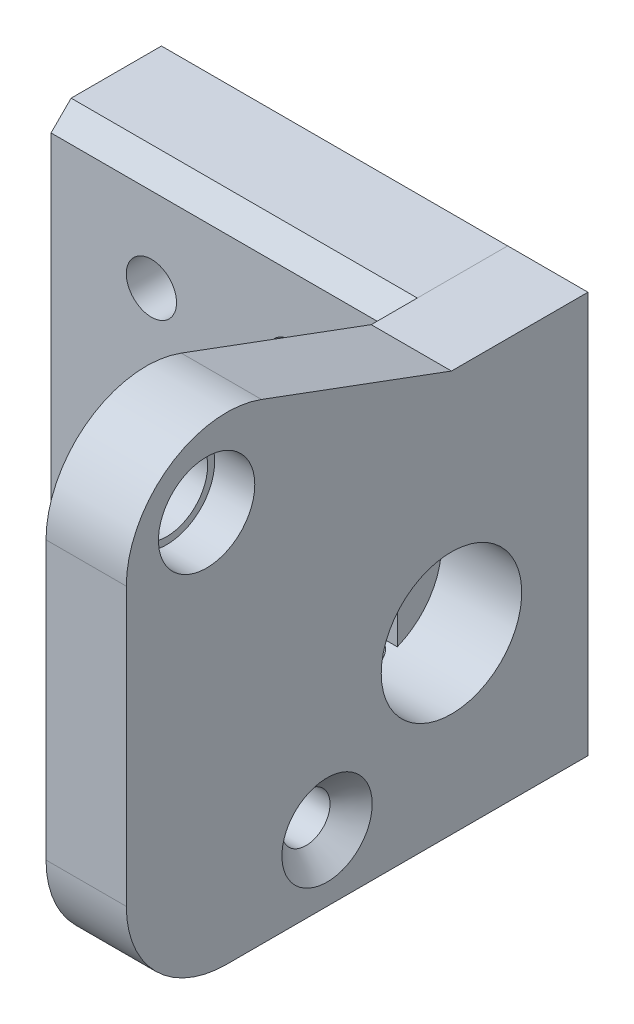
ISO-10303-21;
HEADER;
FILE_DESCRIPTION(('STEP AP214'),'2;1');
FILE_NAME('part.step','',(''),(''),'','','');
FILE_SCHEMA(('AUTOMOTIVE_DESIGN { 1 0 10303 214 1 1 1 1 }'));
ENDSEC;
DATA;
#1=APPLICATION_CONTEXT('core data for automotive mechanical design processes');
#2=APPLICATION_PROTOCOL_DEFINITION('international standard','automotive_design',2000,#1);
#3=PRODUCT_CONTEXT('',#1,'mechanical');
#4=PRODUCT('Part','Part','',(#3));
#5=PRODUCT_RELATED_PRODUCT_CATEGORY('part','',(#4));
#6=PRODUCT_DEFINITION_FORMATION('','',#4);
#7=PRODUCT_DEFINITION_CONTEXT('part definition',#1,'design');
#8=PRODUCT_DEFINITION('design','',#6,#7);
#9=PRODUCT_DEFINITION_SHAPE('','',#8);
#10=(LENGTH_UNIT() NAMED_UNIT(*) SI_UNIT(.MILLI.,.METRE.));
#11=(NAMED_UNIT(*) PLANE_ANGLE_UNIT() SI_UNIT($,.RADIAN.));
#12=(NAMED_UNIT(*) SI_UNIT($,.STERADIAN.) SOLID_ANGLE_UNIT());
#13=UNCERTAINTY_MEASURE_WITH_UNIT(LENGTH_MEASURE(1.E-05),#10,'distance_accuracy_value','');
#14=(GEOMETRIC_REPRESENTATION_CONTEXT(3) GLOBAL_UNCERTAINTY_ASSIGNED_CONTEXT((#13)) GLOBAL_UNIT_ASSIGNED_CONTEXT((#10,
#11,#12)) REPRESENTATION_CONTEXT('',''));
#15=CARTESIAN_POINT('',(0.,0.,0.));
#16=DIRECTION('',(0.,0.,1.));
#17=DIRECTION('',(1.,0.,0.));
#18=AXIS2_PLACEMENT_3D('',#15,#16,#17);
#19=CARTESIAN_POINT('',(22.5,8.,0.));
#20=DIRECTION('',(0.,0.,-1.));
#21=DIRECTION('',(-1.,0.,0.));
#22=AXIS2_PLACEMENT_3D('',#19,#20,#21);
#23=CYLINDRICAL_SURFACE('',#22,1.24999999999999);
#24=CARTESIAN_POINT('',(22.5,8.,0.499999999999998));
#25=DIRECTION('',(0.,0.,1.));
#26=DIRECTION('',(1.,0.,0.));
#27=AXIS2_PLACEMENT_3D('',#24,#25,#26);
#28=CIRCLE('',#27,1.24999999999999);
#29=CARTESIAN_POINT('',(23.75,8.,0.499999999999998));
#30=VERTEX_POINT('',#29);
#31=EDGE_CURVE('E220',#30,#30,#28,.F.);
#32=ORIENTED_EDGE('',*,*,#31,.T.);
#33=EDGE_LOOP('',(#32));
#34=FACE_BOUND('',#33,.T.);
#35=CARTESIAN_POINT('',(22.5,8.,5.5));
#36=DIRECTION('',(0.,0.,1.));
#37=DIRECTION('',(1.,0.,0.));
#38=AXIS2_PLACEMENT_3D('',#35,#36,#37);
#39=CIRCLE('',#38,1.24999999999999);
#40=CARTESIAN_POINT('',(23.75,8.,5.5));
#41=VERTEX_POINT('',#40);
#42=EDGE_CURVE('E480',#41,#41,#39,.F.);
#43=ORIENTED_EDGE('',*,*,#42,.F.);
#44=EDGE_LOOP('',(#43));
#45=FACE_BOUND('',#44,.T.);
#46=ADVANCED_FACE('F38',(#34,#45),#23,.F.);
#47=CARTESIAN_POINT('',(22.5,-6.99999999999998,0.));
#48=DIRECTION('',(0.,0.,-1.));
#49=DIRECTION('',(-1.,0.,0.));
#50=AXIS2_PLACEMENT_3D('',#47,#48,#49);
#51=CYLINDRICAL_SURFACE('',#50,1.24999999999999);
#52=CARTESIAN_POINT('',(22.5,-6.99999999999998,0.499999999999998));
#53=DIRECTION('',(0.,0.,1.));
#54=DIRECTION('',(1.,0.,0.));
#55=AXIS2_PLACEMENT_3D('',#52,#53,#54);
#56=CIRCLE('',#55,1.24999999999999);
#57=CARTESIAN_POINT('',(23.75,-6.99999999999998,0.499999999999998));
#58=VERTEX_POINT('',#57);
#59=EDGE_CURVE('E211',#58,#58,#56,.F.);
#60=ORIENTED_EDGE('',*,*,#59,.T.);
#61=EDGE_LOOP('',(#60));
#62=FACE_BOUND('',#61,.T.);
#63=CARTESIAN_POINT('',(22.5,-6.99999999999998,5.5));
#64=DIRECTION('',(0.,0.,1.));
#65=DIRECTION('',(1.,0.,0.));
#66=AXIS2_PLACEMENT_3D('',#63,#64,#65);
#67=CIRCLE('',#66,1.24999999999999);
#68=CARTESIAN_POINT('',(23.75,-6.99999999999998,5.5));
#69=VERTEX_POINT('',#68);
#70=EDGE_CURVE('E181',#69,#69,#67,.F.);
#71=ORIENTED_EDGE('',*,*,#70,.F.);
#72=EDGE_LOOP('',(#71));
#73=FACE_BOUND('',#72,.T.);
#74=ADVANCED_FACE('F334',(#62,#73),#51,.F.);
#75=CARTESIAN_POINT('',(-34.75,13.2,10.5));
#76=DIRECTION('',(0.,-1.,0.));
#77=DIRECTION('',(0.,0.,-1.));
#78=AXIS2_PLACEMENT_3D('',#75,#76,#77);
#79=PLANE('',#78);
#80=DIRECTION('',(0.,0.,1.));
#81=VECTOR('',#80,1.);
#82=CARTESIAN_POINT('',(17.5,13.2,10.5));
#83=LINE('',#82,#81);
#84=CARTESIAN_POINT('',(17.5,13.2,0.));
#85=VERTEX_POINT('',#84);
#86=CARTESIAN_POINT('',(17.5,13.2,4.49999999999999));
#87=VERTEX_POINT('',#86);
#88=EDGE_CURVE('E193',#85,#87,#83,.T.);
#89=ORIENTED_EDGE('',*,*,#88,.T.);
#90=DIRECTION('',(1.,0.,0.));
#91=VECTOR('',#90,1.);
#92=CARTESIAN_POINT('',(34.75,13.2,4.49999999999999));
#93=LINE('',#92,#91);
#94=CARTESIAN_POINT('',(34.75,13.2,4.49999999999999));
#95=VERTEX_POINT('',#94);
#96=EDGE_CURVE('E268',#87,#95,#93,.T.);
#97=ORIENTED_EDGE('',*,*,#96,.T.);
#98=DIRECTION('',(0.,0.,-1.));
#99=VECTOR('',#98,1.);
#100=CARTESIAN_POINT('',(34.75,13.2,10.5));
#101=LINE('',#100,#99);
#102=CARTESIAN_POINT('',(34.75,13.2,0.));
#103=VERTEX_POINT('',#102);
#104=EDGE_CURVE('E203',#95,#103,#101,.T.);
#105=ORIENTED_EDGE('',*,*,#104,.T.);
#106=DIRECTION('',(1.,0.,0.));
#107=VECTOR('',#106,1.);
#108=CARTESIAN_POINT('',(-34.75,13.2,0.));
#109=LINE('',#108,#107);
#110=EDGE_CURVE('E198',#85,#103,#109,.T.);
#111=ORIENTED_EDGE('',*,*,#110,.F.);
#112=EDGE_LOOP('',(#89,#97,#105,#111));
#113=FACE_BOUND('',#112,.T.);
#114=ADVANCED_FACE('F331',(#113),#79,.F.);
#115=CARTESIAN_POINT('',(17.5,47.1283361405006,0.));
#116=DIRECTION('',(1.,0.,0.));
#117=DIRECTION('',(0.,1.,0.));
#118=AXIS2_PLACEMENT_3D('',#115,#116,#117);
#119=PLANE('',#118);
#120=DIRECTION('',(0.,-1.,0.));
#121=VECTOR('',#120,1.);
#122=CARTESIAN_POINT('',(17.5,47.1283361405006,5.5));
#123=LINE('',#122,#121);
#124=CARTESIAN_POINT('',(17.5,12.2,5.5));
#125=VERTEX_POINT('',#124);
#126=CARTESIAN_POINT('',(17.5,-12.,5.5));
#127=VERTEX_POINT('',#126);
#128=EDGE_CURVE('E168',#125,#127,#123,.T.);
#129=ORIENTED_EDGE('',*,*,#128,.F.);
#130=DIRECTION('',(0.,0.707106781186545,-0.70710678118655));
#131=VECTOR('',#130,1.);
#132=CARTESIAN_POINT('',(17.5,12.2,5.5));
#133=LINE('',#132,#131);
#134=EDGE_CURVE('E266',#125,#87,#133,.T.);
#135=ORIENTED_EDGE('',*,*,#134,.T.);
#136=ORIENTED_EDGE('',*,*,#88,.F.);
#137=DIRECTION('',(0.,-1.,0.));
#138=VECTOR('',#137,1.);
#139=CARTESIAN_POINT('',(17.5,47.1283361405006,0.));
#140=LINE('',#139,#138);
#141=CARTESIAN_POINT('',(17.5,-12.,0.));
#142=VERTEX_POINT('',#141);
#143=EDGE_CURVE('E197',#85,#142,#140,.T.);
#144=ORIENTED_EDGE('',*,*,#143,.T.);
#145=DIRECTION('',(0.,0.,1.));
#146=VECTOR('',#145,1.);
#147=CARTESIAN_POINT('',(17.5,-12.,0.));
#148=LINE('',#147,#146);
#149=EDGE_CURVE('E188',#142,#127,#148,.T.);
#150=ORIENTED_EDGE('',*,*,#149,.T.);
#151=EDGE_LOOP('',(#129,#135,#136,#144,#150));
#152=FACE_BOUND('',#151,.T.);
#153=ADVANCED_FACE('F195',(#152),#119,.F.);
#154=CARTESIAN_POINT('',(-34.75,-12.,10.5));
#155=DIRECTION('',(0.,1.,0.));
#156=DIRECTION('',(0.,0.,1.));
#157=AXIS2_PLACEMENT_3D('',#154,#155,#156);
#158=PLANE('',#157);
#159=DIRECTION('',(1.,0.,0.));
#160=VECTOR('',#159,1.);
#161=CARTESIAN_POINT('',(-34.75,-12.,5.5));
#162=LINE('',#161,#160);
#163=CARTESIAN_POINT('',(29.55,-12.,5.5));
#164=VERTEX_POINT('',#163);
#165=EDGE_CURVE('E173',#127,#164,#162,.T.);
#166=ORIENTED_EDGE('',*,*,#165,.F.);
#167=ORIENTED_EDGE('',*,*,#149,.F.);
#168=DIRECTION('',(1.,0.,0.));
#169=VECTOR('',#168,1.);
#170=CARTESIAN_POINT('',(-34.75,-12.,0.));
#171=LINE('',#170,#169);
#172=CARTESIAN_POINT('',(29.55,-12.,0.));
#173=VERTEX_POINT('',#172);
#174=EDGE_CURVE('E200',#142,#173,#171,.T.);
#175=ORIENTED_EDGE('',*,*,#174,.T.);
#176=DIRECTION('',(0.,0.,1.));
#177=VECTOR('',#176,1.);
#178=CARTESIAN_POINT('',(29.55,-12.,10.5));
#179=LINE('',#178,#177);
#180=EDGE_CURVE('E191',#173,#164,#179,.T.);
#181=ORIENTED_EDGE('',*,*,#180,.T.);
#182=EDGE_LOOP('',(#166,#167,#175,#181));
#183=FACE_BOUND('',#182,.T.);
#184=ADVANCED_FACE('F186',(#183),#158,.F.);
#185=CARTESIAN_POINT('',(38.75,13.2000000000001,18.9999999999999));
#186=DIRECTION('',(-1.,0.,0.));
#187=DIRECTION('',(0.,0.,1.));
#188=AXIS2_PLACEMENT_3D('',#185,#186,#187);
#189=CYLINDRICAL_SURFACE('',#188,2.05);
#190=CARTESIAN_POINT('',(34.75,13.2000000000001,18.9999999999999));
#191=DIRECTION('',(1.,0.,0.));
#192=DIRECTION('',(0.,0.,1.));
#193=AXIS2_PLACEMENT_3D('',#190,#191,#192);
#194=CIRCLE('',#193,2.05);
#195=CARTESIAN_POINT('',(34.75,13.2000000000001,21.0499999999999));
#196=VERTEX_POINT('',#195);
#197=EDGE_CURVE('E466',#196,#196,#194,.T.);
#198=ORIENTED_EDGE('',*,*,#197,.F.);
#199=EDGE_LOOP('',(#198));
#200=FACE_BOUND('',#199,.T.);
#201=CARTESIAN_POINT('',(36.75,13.2000000000001,18.9999999999999));
#202=DIRECTION('',(1.,0.,0.));
#203=DIRECTION('',(0.,0.,-1.));
#204=AXIS2_PLACEMENT_3D('',#201,#202,#203);
#205=CIRCLE('',#204,2.05);
#206=CARTESIAN_POINT('',(36.75,13.2000000000001,16.9499999999999));
#207=VERTEX_POINT('',#206);
#208=EDGE_CURVE('E260',#207,#207,#205,.T.);
#209=ORIENTED_EDGE('',*,*,#208,.T.);
#210=EDGE_LOOP('',(#209));
#211=FACE_BOUND('',#210,.T.);
#212=ADVANCED_FACE('F302',(#200,#211),#189,.F.);
#213=CARTESIAN_POINT('',(34.75,12.,10.5));
#214=DIRECTION('',(-1.,0.,0.));
#215=DIRECTION('',(0.,0.,1.));
#216=AXIS2_PLACEMENT_3D('',#213,#214,#215);
#217=PLANE('',#216);
#218=DIRECTION('',(0.,1.,0.));
#219=VECTOR('',#218,1.);
#220=CARTESIAN_POINT('',(34.75,12.,5.5));
#221=LINE('',#220,#219);
#222=CARTESIAN_POINT('',(34.75,-1.34961536185436,5.5));
#223=VERTEX_POINT('',#222);
#224=CARTESIAN_POINT('',(34.75,5.14961536185442,5.5));
#225=VERTEX_POINT('',#224);
#226=EDGE_CURVE('E423',#223,#225,#221,.T.);
#227=ORIENTED_EDGE('',*,*,#226,.F.);
#228=CARTESIAN_POINT('',(34.75,1.90000000000003,6.79999999999997));
#229=DIRECTION('',(1.,0.,0.));
#230=DIRECTION('',(0.,0.,1.));
#231=AXIS2_PLACEMENT_3D('',#228,#229,#230);
#232=CIRCLE('',#231,3.5);
#233=EDGE_CURVE('E460',#223,#225,#232,.T.);
#234=ORIENTED_EDGE('',*,*,#233,.T.);
#235=EDGE_LOOP('',(#227,#234));
#236=FACE_BOUND('',#235,.T.);
#237=ADVANCED_FACE('F346',(#236),#217,.F.);
#238=CARTESIAN_POINT('',(29.5,8.,0.));
#239=DIRECTION('',(0.,0.,-1.));
#240=DIRECTION('',(-1.,0.,0.));
#241=AXIS2_PLACEMENT_3D('',#238,#239,#240);
#242=CYLINDRICAL_SURFACE('',#241,1.24999999999999);
#243=CARTESIAN_POINT('',(29.5,8.,0.499999999999998));
#244=DIRECTION('',(0.,0.,1.));
#245=DIRECTION('',(1.,0.,0.));
#246=AXIS2_PLACEMENT_3D('',#243,#244,#245);
#247=CIRCLE('',#246,1.24999999999999);
#248=CARTESIAN_POINT('',(30.75,8.,0.499999999999998));
#249=VERTEX_POINT('',#248);
#250=EDGE_CURVE('E232',#249,#249,#247,.F.);
#251=ORIENTED_EDGE('',*,*,#250,.T.);
#252=EDGE_LOOP('',(#251));
#253=FACE_BOUND('',#252,.T.);
#254=CARTESIAN_POINT('',(29.5,8.,5.5));
#255=DIRECTION('',(0.,0.,1.));
#256=DIRECTION('',(1.,0.,0.));
#257=AXIS2_PLACEMENT_3D('',#254,#255,#256);
#258=CIRCLE('',#257,1.24999999999999);
#259=CARTESIAN_POINT('',(30.75,8.,5.5));
#260=VERTEX_POINT('',#259);
#261=EDGE_CURVE('E414',#260,#260,#258,.F.);
#262=ORIENTED_EDGE('',*,*,#261,.F.);
#263=EDGE_LOOP('',(#262));
#264=FACE_BOUND('',#263,.T.);
#265=ADVANCED_FACE('F342',(#253,#264),#242,.F.);
#266=CARTESIAN_POINT('',(29.5,-6.99999999999998,0.));
#267=DIRECTION('',(0.,0.,-1.));
#268=DIRECTION('',(-1.,0.,0.));
#269=AXIS2_PLACEMENT_3D('',#266,#267,#268);
#270=CYLINDRICAL_SURFACE('',#269,1.24999999999999);
#271=CARTESIAN_POINT('',(29.5,-6.99999999999998,0.499999999999998));
#272=DIRECTION('',(0.,0.,1.));
#273=DIRECTION('',(1.,0.,0.));
#274=AXIS2_PLACEMENT_3D('',#271,#272,#273);
#275=CIRCLE('',#274,1.24999999999999);
#276=CARTESIAN_POINT('',(30.75,-6.99999999999998,0.499999999999998));
#277=VERTEX_POINT('',#276);
#278=EDGE_CURVE('E223',#277,#277,#275,.F.);
#279=ORIENTED_EDGE('',*,*,#278,.T.);
#280=EDGE_LOOP('',(#279));
#281=FACE_BOUND('',#280,.T.);
#282=CARTESIAN_POINT('',(29.5,-6.99999999999998,5.5));
#283=DIRECTION('',(0.,0.,1.));
#284=DIRECTION('',(1.,0.,0.));
#285=AXIS2_PLACEMENT_3D('',#282,#283,#284);
#286=CIRCLE('',#285,1.24999999999999);
#287=CARTESIAN_POINT('',(30.75,-6.99999999999998,5.5));
#288=VERTEX_POINT('',#287);
#289=EDGE_CURVE('E416',#288,#288,#286,.F.);
#290=ORIENTED_EDGE('',*,*,#289,.F.);
#291=EDGE_LOOP('',(#290));
#292=FACE_BOUND('',#291,.T.);
#293=ADVANCED_FACE('F345',(#281,#292),#270,.F.);
#294=CARTESIAN_POINT('',(34.75,-6.8,10.5));
#295=DIRECTION('',(-0.707106781186546,0.707106781186549,0.));
#296=DIRECTION('',(-0.707106781186549,-0.707106781186546,0.));
#297=AXIS2_PLACEMENT_3D('',#294,#295,#296);
#298=PLANE('',#297);
#299=DIRECTION('',(0.,0.,-1.));
#300=VECTOR('',#299,1.);
#301=CARTESIAN_POINT('',(34.75,-6.8,10.5));
#302=LINE('',#301,#300);
#303=CARTESIAN_POINT('',(34.75,-6.8,5.5));
#304=VERTEX_POINT('',#303);
#305=CARTESIAN_POINT('',(34.75,-6.8,0.));
#306=VERTEX_POINT('',#305);
#307=EDGE_CURVE('E236',#304,#306,#302,.T.);
#308=ORIENTED_EDGE('',*,*,#307,.F.);
#309=DIRECTION('',(0.707106781186549,0.707106781186546,0.));
#310=VECTOR('',#309,1.);
#311=CARTESIAN_POINT('',(34.75,-6.8,5.5));
#312=LINE('',#311,#310);
#313=EDGE_CURVE('E424',#304,#164,#312,.F.);
#314=ORIENTED_EDGE('',*,*,#313,.T.);
#315=ORIENTED_EDGE('',*,*,#180,.F.);
#316=DIRECTION('',(0.707106781186549,0.707106781186546,0.));
#317=VECTOR('',#316,1.);
#318=CARTESIAN_POINT('',(34.75,-6.8,0.));
#319=LINE('',#318,#317);
#320=EDGE_CURVE('E238',#306,#173,#319,.F.);
#321=ORIENTED_EDGE('',*,*,#320,.F.);
#322=EDGE_LOOP('',(#308,#314,#315,#321));
#323=FACE_BOUND('',#322,.T.);
#324=ADVANCED_FACE('F350',(#323),#298,.F.);
#325=DIRECTION('',(0.,0.,-1.));
#326=VECTOR('',#325,1.);
#327=CARTESIAN_POINT('',(34.75,-6.79797568482309,23.));
#328=LINE('',#327,#326);
#329=CARTESIAN_POINT('',(34.75,-6.79797568482309,5.5));
#330=VERTEX_POINT('',#329);
#331=CARTESIAN_POINT('',(34.75,-6.79797568482309,0.));
#332=VERTEX_POINT('',#331);
#333=EDGE_CURVE('E192',#330,#332,#328,.T.);
#334=ORIENTED_EDGE('',*,*,#333,.F.);
#335=EDGE_CURVE('E421',#304,#330,#221,.T.);
#336=ORIENTED_EDGE('',*,*,#335,.F.);
#337=ORIENTED_EDGE('',*,*,#307,.T.);
#338=DIRECTION('',(0.,1.,0.));
#339=VECTOR('',#338,1.);
#340=CARTESIAN_POINT('',(34.75,12.,0.));
#341=LINE('',#340,#339);
#342=EDGE_CURVE('E208',#306,#332,#341,.T.);
#343=ORIENTED_EDGE('',*,*,#342,.T.);
#344=EDGE_LOOP('',(#334,#336,#337,#343));
#345=FACE_BOUND('',#344,.T.);
#346=ADVANCED_FACE('F358',(#345),#217,.F.);
#347=CARTESIAN_POINT('',(22.5,8.,0.499999999999998));
#348=DIRECTION('',(0.,0.,-1.));
#349=DIRECTION('',(-1.,0.,0.));
#350=AXIS2_PLACEMENT_3D('',#347,#348,#349);
#351=CONICAL_SURFACE('',#350,1.24999999999999,0.785398163397451);
#352=CARTESIAN_POINT('',(22.5,8.,0.));
#353=DIRECTION('',(0.,0.,1.));
#354=DIRECTION('',(1.,0.,0.));
#355=AXIS2_PLACEMENT_3D('',#352,#353,#354);
#356=CIRCLE('',#355,1.74999999999999);
#357=CARTESIAN_POINT('',(24.25,8.,0.));
#358=VERTEX_POINT('',#357);
#359=EDGE_CURVE('E214',#358,#358,#356,.T.);
#360=ORIENTED_EDGE('',*,*,#359,.F.);
#361=EDGE_LOOP('',(#360));
#362=FACE_BOUND('',#361,.T.);
#363=ORIENTED_EDGE('',*,*,#31,.F.);
#364=EDGE_LOOP('',(#363));
#365=FACE_BOUND('',#364,.T.);
#366=ADVANCED_FACE('F361',(#362,#365),#351,.F.);
#367=CARTESIAN_POINT('',(22.5,-6.99999999999998,0.499999999999998));
#368=DIRECTION('',(0.,0.,-1.));
#369=DIRECTION('',(-1.,0.,0.));
#370=AXIS2_PLACEMENT_3D('',#367,#368,#369);
#371=CONICAL_SURFACE('',#370,1.24999999999999,0.785398163397451);
#372=CARTESIAN_POINT('',(22.5,-6.99999999999998,0.));
#373=DIRECTION('',(0.,0.,1.));
#374=DIRECTION('',(1.,0.,0.));
#375=AXIS2_PLACEMENT_3D('',#372,#373,#374);
#376=CIRCLE('',#375,1.74999999999999);
#377=CARTESIAN_POINT('',(24.25,-6.99999999999998,0.));
#378=VERTEX_POINT('',#377);
#379=EDGE_CURVE('E217',#378,#378,#376,.T.);
#380=ORIENTED_EDGE('',*,*,#379,.F.);
#381=EDGE_LOOP('',(#380));
#382=FACE_BOUND('',#381,.T.);
#383=ORIENTED_EDGE('',*,*,#59,.F.);
#384=EDGE_LOOP('',(#383));
#385=FACE_BOUND('',#384,.T.);
#386=ADVANCED_FACE('F365',(#382,#385),#371,.F.);
#387=CARTESIAN_POINT('',(29.5,8.,0.499999999999998));
#388=DIRECTION('',(0.,0.,-1.));
#389=DIRECTION('',(-1.,0.,0.));
#390=AXIS2_PLACEMENT_3D('',#387,#388,#389);
#391=CONICAL_SURFACE('',#390,1.24999999999999,0.785398163397451);
#392=CARTESIAN_POINT('',(29.5,8.,0.));
#393=DIRECTION('',(0.,0.,1.));
#394=DIRECTION('',(1.,0.,0.));
#395=AXIS2_PLACEMENT_3D('',#392,#393,#394);
#396=CIRCLE('',#395,1.74999999999999);
#397=CARTESIAN_POINT('',(31.25,8.,0.));
#398=VERTEX_POINT('',#397);
#399=EDGE_CURVE('E226',#398,#398,#396,.T.);
#400=ORIENTED_EDGE('',*,*,#399,.F.);
#401=EDGE_LOOP('',(#400));
#402=FACE_BOUND('',#401,.T.);
#403=ORIENTED_EDGE('',*,*,#250,.F.);
#404=EDGE_LOOP('',(#403));
#405=FACE_BOUND('',#404,.T.);
#406=ADVANCED_FACE('F368',(#402,#405),#391,.F.);
#407=CARTESIAN_POINT('',(29.5,-6.99999999999998,0.499999999999998));
#408=DIRECTION('',(0.,0.,-1.));
#409=DIRECTION('',(-1.,0.,0.));
#410=AXIS2_PLACEMENT_3D('',#407,#408,#409);
#411=CONICAL_SURFACE('',#410,1.24999999999999,0.785398163397451);
#412=CARTESIAN_POINT('',(29.5,-6.99999999999998,0.));
#413=DIRECTION('',(0.,0.,1.));
#414=DIRECTION('',(1.,0.,0.));
#415=AXIS2_PLACEMENT_3D('',#412,#413,#414);
#416=CIRCLE('',#415,1.74999999999999);
#417=CARTESIAN_POINT('',(31.25,-6.99999999999998,0.));
#418=VERTEX_POINT('',#417);
#419=EDGE_CURVE('E229',#418,#418,#416,.T.);
#420=ORIENTED_EDGE('',*,*,#419,.F.);
#421=EDGE_LOOP('',(#420));
#422=FACE_BOUND('',#421,.T.);
#423=ORIENTED_EDGE('',*,*,#278,.F.);
#424=EDGE_LOOP('',(#423));
#425=FACE_BOUND('',#424,.T.);
#426=ADVANCED_FACE('F356',(#422,#425),#411,.F.);
#427=CARTESIAN_POINT('',(-34.75,-12.,0.));
#428=DIRECTION('',(0.,0.,1.));
#429=DIRECTION('',(1.,0.,0.));
#430=AXIS2_PLACEMENT_3D('',#427,#428,#429);
#431=PLANE('',#430);
#432=ORIENTED_EDGE('',*,*,#419,.T.);
#433=EDGE_LOOP('',(#432));
#434=FACE_BOUND('',#433,.T.);
#435=ORIENTED_EDGE('',*,*,#399,.T.);
#436=EDGE_LOOP('',(#435));
#437=FACE_BOUND('',#436,.T.);
#438=ORIENTED_EDGE('',*,*,#379,.T.);
#439=EDGE_LOOP('',(#438));
#440=FACE_BOUND('',#439,.T.);
#441=ORIENTED_EDGE('',*,*,#359,.T.);
#442=EDGE_LOOP('',(#441));
#443=FACE_BOUND('',#442,.T.);
#444=ORIENTED_EDGE('',*,*,#143,.F.);
#445=ORIENTED_EDGE('',*,*,#110,.T.);
#446=DIRECTION('',(0.,1.,0.));
#447=VECTOR('',#446,1.);
#448=CARTESIAN_POINT('',(34.75,-6.79797568482309,0.));
#449=LINE('',#448,#447);
#450=CARTESIAN_POINT('',(34.75,13.2020243151769,0.));
#451=VERTEX_POINT('',#450);
#452=EDGE_CURVE('E412',#103,#451,#449,.T.);
#453=ORIENTED_EDGE('',*,*,#452,.T.);
#454=DIRECTION('',(-1.,0.,0.));
#455=VECTOR('',#454,1.);
#456=CARTESIAN_POINT('',(38.75,13.2020243151769,0.));
#457=LINE('',#456,#455);
#458=CARTESIAN_POINT('',(38.75,13.2020243151769,0.));
#459=VERTEX_POINT('',#458);
#460=EDGE_CURVE('E429',#459,#451,#457,.T.);
#461=ORIENTED_EDGE('',*,*,#460,.F.);
#462=DIRECTION('',(0.,1.,0.));
#463=VECTOR('',#462,1.);
#464=CARTESIAN_POINT('',(38.75,-6.79797568482309,0.));
#465=LINE('',#464,#463);
#466=CARTESIAN_POINT('',(38.75,-6.79797568482309,0.));
#467=VERTEX_POINT('',#466);
#468=EDGE_CURVE('E457',#467,#459,#465,.T.);
#469=ORIENTED_EDGE('',*,*,#468,.F.);
#470=DIRECTION('',(-1.,0.,0.));
#471=VECTOR('',#470,1.);
#472=CARTESIAN_POINT('',(38.75,-6.79797568482309,0.));
#473=LINE('',#472,#471);
#474=EDGE_CURVE('E426',#467,#332,#473,.T.);
#475=ORIENTED_EDGE('',*,*,#474,.T.);
#476=ORIENTED_EDGE('',*,*,#342,.F.);
#477=ORIENTED_EDGE('',*,*,#320,.T.);
#478=ORIENTED_EDGE('',*,*,#174,.F.);
#479=EDGE_LOOP('',(#444,#445,#453,#461,#469,#475,#476,#477,#478));
#480=FACE_BOUND('',#479,.T.);
#481=ADVANCED_FACE('F329',(#434,#437,#440,#443,#480),#431,.F.);
#482=CARTESIAN_POINT('',(0.,0.,5.5));
#483=DIRECTION('',(0.,0.,1.));
#484=DIRECTION('',(1.,0.,0.));
#485=AXIS2_PLACEMENT_3D('',#482,#483,#484);
#486=PLANE('',#485);
#487=ORIENTED_EDGE('',*,*,#289,.T.);
#488=EDGE_LOOP('',(#487));
#489=FACE_BOUND('',#488,.T.);
#490=ORIENTED_EDGE('',*,*,#261,.T.);
#491=EDGE_LOOP('',(#490));
#492=FACE_BOUND('',#491,.T.);
#493=DIRECTION('',(0.,1.,0.));
#494=VECTOR('',#493,1.);
#495=CARTESIAN_POINT('',(33.75,0.,5.5));
#496=LINE('',#495,#494);
#497=CARTESIAN_POINT('',(33.75,-6.79797568482309,5.5));
#498=VERTEX_POINT('',#497);
#499=CARTESIAN_POINT('',(33.75,-1.34961536185436,5.5));
#500=VERTEX_POINT('',#499);
#501=EDGE_CURVE('E276',#498,#500,#496,.T.);
#502=ORIENTED_EDGE('',*,*,#501,.T.);
#503=DIRECTION('',(-1.,0.,0.));
#504=VECTOR('',#503,1.);
#505=CARTESIAN_POINT('',(33.75,-1.34961536185436,5.5));
#506=LINE('',#505,#504);
#507=EDGE_CURVE('E278',#500,#223,#506,.F.);
#508=ORIENTED_EDGE('',*,*,#507,.T.);
#509=ORIENTED_EDGE('',*,*,#226,.T.);
#510=DIRECTION('',(-1.,0.,0.));
#511=VECTOR('',#510,1.);
#512=CARTESIAN_POINT('',(34.75,5.14961536185442,5.5));
#513=LINE('',#512,#511);
#514=CARTESIAN_POINT('',(33.75,5.14961536185442,5.5));
#515=VERTEX_POINT('',#514);
#516=EDGE_CURVE('E58',#225,#515,#513,.T.);
#517=ORIENTED_EDGE('',*,*,#516,.T.);
#518=DIRECTION('',(0.,1.,0.));
#519=VECTOR('',#518,1.);
#520=CARTESIAN_POINT('',(33.75,0.,5.5));
#521=LINE('',#520,#519);
#522=CARTESIAN_POINT('',(33.75,12.2,5.5));
#523=VERTEX_POINT('',#522);
#524=EDGE_CURVE('E273',#515,#523,#521,.T.);
#525=ORIENTED_EDGE('',*,*,#524,.T.);
#526=DIRECTION('',(-1.,0.,0.));
#527=VECTOR('',#526,1.);
#528=CARTESIAN_POINT('',(17.5,12.2,5.5));
#529=LINE('',#528,#527);
#530=EDGE_CURVE('E177',#523,#125,#529,.T.);
#531=ORIENTED_EDGE('',*,*,#530,.T.);
#532=ORIENTED_EDGE('',*,*,#128,.T.);
#533=ORIENTED_EDGE('',*,*,#165,.T.);
#534=ORIENTED_EDGE('',*,*,#313,.F.);
#535=ORIENTED_EDGE('',*,*,#335,.T.);
#536=DIRECTION('',(-1.,0.,0.));
#537=VECTOR('',#536,1.);
#538=CARTESIAN_POINT('',(0.,-6.79797568482309,5.5));
#539=LINE('',#538,#537);
#540=EDGE_CURVE('E66',#330,#498,#539,.T.);
#541=ORIENTED_EDGE('',*,*,#540,.T.);
#542=EDGE_LOOP('',(#502,#508,#509,#517,#525,#531,#532,#533,#534,#535,#541));
#543=FACE_BOUND('',#542,.T.);
#544=ORIENTED_EDGE('',*,*,#70,.T.);
#545=EDGE_LOOP('',(#544));
#546=FACE_BOUND('',#545,.T.);
#547=ORIENTED_EDGE('',*,*,#42,.T.);
#548=EDGE_LOOP('',(#547));
#549=FACE_BOUND('',#548,.T.);
#550=ADVANCED_FACE('F171',(#489,#492,#543,#546,#549),#486,.T.);
#551=CARTESIAN_POINT('',(38.75,0.,0.));
#552=DIRECTION('',(1.,0.,0.));
#553=DIRECTION('',(0.,0.,-1.));
#554=AXIS2_PLACEMENT_3D('',#551,#552,#553);
#555=PLANE('',#554);
#556=CARTESIAN_POINT('',(38.75,13.2000000000001,18.9999999999999));
#557=DIRECTION('',(1.,0.,0.));
#558=DIRECTION('',(0.,0.,-1.));
#559=AXIS2_PLACEMENT_3D('',#556,#557,#558);
#560=CIRCLE('',#559,2.4);
#561=CARTESIAN_POINT('',(38.75,13.2000000000001,16.5999999999999));
#562=VERTEX_POINT('',#561);
#563=EDGE_CURVE('E477',#562,#562,#560,.T.);
#564=ORIENTED_EDGE('',*,*,#563,.F.);
#565=EDGE_LOOP('',(#564));
#566=FACE_BOUND('',#565,.T.);
#567=CARTESIAN_POINT('',(38.75,-3.49999999999993,12.9999999999999));
#568=DIRECTION('',(1.,0.,0.));
#569=DIRECTION('',(0.,0.,-1.));
#570=AXIS2_PLACEMENT_3D('',#567,#568,#569);
#571=CIRCLE('',#570,2.25);
#572=CARTESIAN_POINT('',(38.75,-3.49999999999993,10.7499999999999));
#573=VERTEX_POINT('',#572);
#574=EDGE_CURVE('E263',#573,#573,#571,.T.);
#575=ORIENTED_EDGE('',*,*,#574,.F.);
#576=EDGE_LOOP('',(#575));
#577=FACE_BOUND('',#576,.T.);
#578=CARTESIAN_POINT('',(38.75,1.90000000000003,6.79999999999997));
#579=DIRECTION('',(1.,0.,0.));
#580=DIRECTION('',(0.,0.,1.));
#581=AXIS2_PLACEMENT_3D('',#578,#579,#580);
#582=CIRCLE('',#581,3.5);
#583=CARTESIAN_POINT('',(38.75,1.90000000000003,10.3));
#584=VERTEX_POINT('',#583);
#585=EDGE_CURVE('E449',#584,#584,#582,.T.);
#586=ORIENTED_EDGE('',*,*,#585,.F.);
#587=EDGE_LOOP('',(#586));
#588=FACE_BOUND('',#587,.T.);
#589=DIRECTION('',(0.,0.347314355823594,0.937748760723704));
#590=VECTOR('',#589,1.);
#591=CARTESIAN_POINT('',(38.75,13.2020243151769,6.79999999999999));
#592=LINE('',#591,#590);
#593=CARTESIAN_POINT('',(38.75,13.2020243151769,6.79999999999999));
#594=VERTEX_POINT('',#593);
#595=CARTESIAN_POINT('',(38.75,16.7069977303184,16.263428220882));
#596=VERTEX_POINT('',#595);
#597=EDGE_CURVE('E452',#594,#596,#592,.T.);
#598=ORIENTED_EDGE('',*,*,#597,.T.);
#599=CARTESIAN_POINT('',(38.75,12.0182539266999,18.));
#600=DIRECTION('',(1.,0.,0.));
#601=DIRECTION('',(0.,0.,-1.));
#602=AXIS2_PLACEMENT_3D('',#599,#600,#601);
#603=CIRCLE('',#602,5.);
#604=CARTESIAN_POINT('',(38.75,12.0182539266999,23.));
#605=VERTEX_POINT('',#604);
#606=EDGE_CURVE('E255',#596,#605,#603,.T.);
#607=ORIENTED_EDGE('',*,*,#606,.T.);
#608=DIRECTION('',(0.,-1.,0.));
#609=VECTOR('',#608,1.);
#610=CARTESIAN_POINT('',(38.75,19.2020243151769,23.));
#611=LINE('',#610,#609);
#612=CARTESIAN_POINT('',(38.75,-1.79797568482308,23.));
#613=VERTEX_POINT('',#612);
#614=EDGE_CURVE('E435',#605,#613,#611,.T.);
#615=ORIENTED_EDGE('',*,*,#614,.T.);
#616=CARTESIAN_POINT('',(38.75,-1.79797568482309,18.));
#617=DIRECTION('',(1.,0.,0.));
#618=DIRECTION('',(0.,0.,-1.));
#619=AXIS2_PLACEMENT_3D('',#616,#617,#618);
#620=CIRCLE('',#619,5.);
#621=CARTESIAN_POINT('',(38.75,-6.79797568482309,18.));
#622=VERTEX_POINT('',#621);
#623=EDGE_CURVE('E253',#613,#622,#620,.T.);
#624=ORIENTED_EDGE('',*,*,#623,.T.);
#625=DIRECTION('',(0.,0.,-1.));
#626=VECTOR('',#625,1.);
#627=CARTESIAN_POINT('',(38.75,-6.79797568482309,23.));
#628=LINE('',#627,#626);
#629=EDGE_CURVE('E439',#622,#467,#628,.T.);
#630=ORIENTED_EDGE('',*,*,#629,.T.);
#631=ORIENTED_EDGE('',*,*,#468,.T.);
#632=DIRECTION('',(0.,0.,1.));
#633=VECTOR('',#632,1.);
#634=CARTESIAN_POINT('',(38.75,13.2020243151769,0.));
#635=LINE('',#634,#633);
#636=EDGE_CURVE('E455',#459,#594,#635,.T.);
#637=ORIENTED_EDGE('',*,*,#636,.T.);
#638=EDGE_LOOP('',(#598,#607,#615,#624,#630,#631,#637));
#639=FACE_BOUND('',#638,.T.);
#640=ADVANCED_FACE('F304',(#566,#577,#588,#639),#555,.T.);
#641=CARTESIAN_POINT('',(34.75,0.,0.));
#642=DIRECTION('',(1.,0.,0.));
#643=DIRECTION('',(0.,0.,-1.));
#644=AXIS2_PLACEMENT_3D('',#641,#642,#643);
#645=PLANE('',#644);
#646=CARTESIAN_POINT('',(34.75,-3.49999999999993,12.9999999999999));
#647=DIRECTION('',(1.,0.,0.));
#648=DIRECTION('',(0.,0.,-1.));
#649=AXIS2_PLACEMENT_3D('',#646,#647,#648);
#650=CIRCLE('',#649,1.19999999999999);
#651=CARTESIAN_POINT('',(34.75,-3.49999999999993,11.7999999999999));
#652=VERTEX_POINT('',#651);
#653=EDGE_CURVE('E469',#652,#652,#650,.T.);
#654=ORIENTED_EDGE('',*,*,#653,.T.);
#655=EDGE_LOOP('',(#654));
#656=FACE_BOUND('',#655,.T.);
#657=CARTESIAN_POINT('',(34.75,5.38711915483256,6.5));
#658=VERTEX_POINT('',#657);
#659=CARTESIAN_POINT('',(34.75,-1.58711915483251,6.5));
#660=VERTEX_POINT('',#659);
#661=EDGE_CURVE('E463',#658,#660,#232,.T.);
#662=ORIENTED_EDGE('',*,*,#661,.T.);
#663=DIRECTION('',(0.,1.,0.));
#664=VECTOR('',#663,1.);
#665=CARTESIAN_POINT('',(34.75,0.,6.5));
#666=LINE('',#665,#664);
#667=CARTESIAN_POINT('',(34.75,-6.79797568482309,6.5));
#668=VERTEX_POINT('',#667);
#669=EDGE_CURVE('E282',#660,#668,#666,.F.);
#670=ORIENTED_EDGE('',*,*,#669,.T.);
#671=CARTESIAN_POINT('',(34.75,-6.79797568482309,18.));
#672=VERTEX_POINT('',#671);
#673=EDGE_CURVE('E446',#672,#668,#328,.T.);
#674=ORIENTED_EDGE('',*,*,#673,.F.);
#675=CARTESIAN_POINT('',(34.75,-1.79797568482309,18.));
#676=DIRECTION('',(1.,0.,0.));
#677=DIRECTION('',(0.,0.,-1.));
#678=AXIS2_PLACEMENT_3D('',#675,#676,#677);
#679=CIRCLE('',#678,5.);
#680=CARTESIAN_POINT('',(34.75,-1.79797568482308,23.));
#681=VERTEX_POINT('',#680);
#682=EDGE_CURVE('E247',#672,#681,#679,.F.);
#683=ORIENTED_EDGE('',*,*,#682,.T.);
#684=DIRECTION('',(0.,-1.,0.));
#685=VECTOR('',#684,1.);
#686=CARTESIAN_POINT('',(34.75,19.2020243151769,23.));
#687=LINE('',#686,#685);
#688=CARTESIAN_POINT('',(34.75,12.0182539266999,23.));
#689=VERTEX_POINT('',#688);
#690=EDGE_CURVE('E436',#689,#681,#687,.T.);
#691=ORIENTED_EDGE('',*,*,#690,.F.);
#692=CARTESIAN_POINT('',(34.75,12.0182539266999,18.));
#693=DIRECTION('',(1.,0.,0.));
#694=DIRECTION('',(0.,0.,-1.));
#695=AXIS2_PLACEMENT_3D('',#692,#693,#694);
#696=CIRCLE('',#695,5.);
#697=CARTESIAN_POINT('',(34.75,16.7069977303184,16.263428220882));
#698=VERTEX_POINT('',#697);
#699=EDGE_CURVE('E249',#689,#698,#696,.F.);
#700=ORIENTED_EDGE('',*,*,#699,.T.);
#701=DIRECTION('',(0.,0.347314355823594,0.937748760723704));
#702=VECTOR('',#701,1.);
#703=CARTESIAN_POINT('',(34.75,13.2020243151769,6.79999999999999));
#704=LINE('',#703,#702);
#705=CARTESIAN_POINT('',(34.75,13.2020243151769,6.79999999999999));
#706=VERTEX_POINT('',#705);
#707=EDGE_CURVE('E440',#706,#698,#704,.T.);
#708=ORIENTED_EDGE('',*,*,#707,.F.);
#709=DIRECTION('',(0.,0.,1.));
#710=VECTOR('',#709,1.);
#711=CARTESIAN_POINT('',(34.75,13.2020243151769,0.));
#712=LINE('',#711,#710);
#713=EDGE_CURVE('E443',#451,#706,#712,.T.);
#714=ORIENTED_EDGE('',*,*,#713,.F.);
#715=ORIENTED_EDGE('',*,*,#452,.F.);
#716=ORIENTED_EDGE('',*,*,#104,.F.);
#717=DIRECTION('',(0.,-0.707106781186545,0.70710678118655));
#718=VECTOR('',#717,1.);
#719=CARTESIAN_POINT('',(34.75,8.85000000000004,8.84999999999998));
#720=LINE('',#719,#718);
#721=CARTESIAN_POINT('',(34.75,11.2,6.5));
#722=VERTEX_POINT('',#721);
#723=EDGE_CURVE('E270',#95,#722,#720,.T.);
#724=ORIENTED_EDGE('',*,*,#723,.T.);
#725=DIRECTION('',(0.,1.,0.));
#726=VECTOR('',#725,1.);
#727=CARTESIAN_POINT('',(34.75,0.,6.5));
#728=LINE('',#727,#726);
#729=EDGE_CURVE('E280',#722,#658,#728,.F.);
#730=ORIENTED_EDGE('',*,*,#729,.T.);
#731=EDGE_LOOP('',(#662,#670,#674,#683,#691,#700,#708,#714,#715,#716,#724,#730));
#732=FACE_BOUND('',#731,.T.);
#733=ORIENTED_EDGE('',*,*,#197,.T.);
#734=EDGE_LOOP('',(#733));
#735=FACE_BOUND('',#734,.T.);
#736=ADVANCED_FACE('F308',(#656,#732,#735),#645,.F.);
#737=CARTESIAN_POINT('',(38.75,-6.79797568482309,23.));
#738=DIRECTION('',(0.,1.,0.));
#739=DIRECTION('',(0.,0.,1.));
#740=AXIS2_PLACEMENT_3D('',#737,#738,#739);
#741=PLANE('',#740);
#742=ORIENTED_EDGE('',*,*,#629,.F.);
#743=DIRECTION('',(-1.,0.,0.));
#744=VECTOR('',#743,1.);
#745=CARTESIAN_POINT('',(38.75,-6.79797568482309,18.));
#746=LINE('',#745,#744);
#747=EDGE_CURVE('E257',#622,#672,#746,.T.);
#748=ORIENTED_EDGE('',*,*,#747,.T.);
#749=ORIENTED_EDGE('',*,*,#673,.T.);
#750=CARTESIAN_POINT('',(33.75,-6.79797568482309,6.5));
#751=DIRECTION('',(0.,1.,0.));
#752=DIRECTION('',(0.,0.,1.));
#753=AXIS2_PLACEMENT_3D('',#750,#751,#752);
#754=CIRCLE('',#753,1.);
#755=EDGE_CURVE('E290',#668,#498,#754,.T.);
#756=ORIENTED_EDGE('',*,*,#755,.T.);
#757=ORIENTED_EDGE('',*,*,#540,.F.);
#758=ORIENTED_EDGE('',*,*,#333,.T.);
#759=ORIENTED_EDGE('',*,*,#474,.F.);
#760=EDGE_LOOP('',(#742,#748,#749,#756,#757,#758,#759));
#761=FACE_BOUND('',#760,.T.);
#762=ADVANCED_FACE('F312',(#761),#741,.F.);
#763=CARTESIAN_POINT('',(38.75,13.2020243151769,0.));
#764=DIRECTION('',(0.,-1.,0.));
#765=DIRECTION('',(0.,0.,-1.));
#766=AXIS2_PLACEMENT_3D('',#763,#764,#765);
#767=PLANE('',#766);
#768=ORIENTED_EDGE('',*,*,#713,.T.);
#769=DIRECTION('',(-1.,0.,0.));
#770=VECTOR('',#769,1.);
#771=CARTESIAN_POINT('',(38.75,13.2020243151769,6.79999999999999));
#772=LINE('',#771,#770);
#773=EDGE_CURVE('E432',#594,#706,#772,.T.);
#774=ORIENTED_EDGE('',*,*,#773,.F.);
#775=ORIENTED_EDGE('',*,*,#636,.F.);
#776=ORIENTED_EDGE('',*,*,#460,.T.);
#777=EDGE_LOOP('',(#768,#774,#775,#776));
#778=FACE_BOUND('',#777,.T.);
#779=ADVANCED_FACE('F320',(#778),#767,.F.);
#780=CARTESIAN_POINT('',(38.75,13.2020243151769,6.79999999999999));
#781=DIRECTION('',(0.,-0.937748760723704,0.347314355823594));
#782=DIRECTION('',(0.,-0.347314355823594,-0.937748760723704));
#783=AXIS2_PLACEMENT_3D('',#780,#781,#782);
#784=PLANE('',#783);
#785=ORIENTED_EDGE('',*,*,#707,.T.);
#786=DIRECTION('',(-1.,0.,0.));
#787=VECTOR('',#786,1.);
#788=CARTESIAN_POINT('',(38.75,16.7069977303184,16.263428220882));
#789=LINE('',#788,#787);
#790=EDGE_CURVE('E251',#698,#596,#789,.F.);
#791=ORIENTED_EDGE('',*,*,#790,.T.);
#792=ORIENTED_EDGE('',*,*,#597,.F.);
#793=ORIENTED_EDGE('',*,*,#773,.T.);
#794=EDGE_LOOP('',(#785,#791,#792,#793));
#795=FACE_BOUND('',#794,.T.);
#796=ADVANCED_FACE('F316',(#795),#784,.F.);
#797=CARTESIAN_POINT('',(38.75,19.2020243151769,23.));
#798=DIRECTION('',(0.,0.,-1.));
#799=DIRECTION('',(0.,1.,0.));
#800=AXIS2_PLACEMENT_3D('',#797,#798,#799);
#801=PLANE('',#800);
#802=ORIENTED_EDGE('',*,*,#614,.F.);
#803=DIRECTION('',(-1.,0.,0.));
#804=VECTOR('',#803,1.);
#805=CARTESIAN_POINT('',(38.75,12.0182539266999,23.));
#806=LINE('',#805,#804);
#807=EDGE_CURVE('E244',#605,#689,#806,.T.);
#808=ORIENTED_EDGE('',*,*,#807,.T.);
#809=ORIENTED_EDGE('',*,*,#690,.T.);
#810=DIRECTION('',(-1.,0.,0.));
#811=VECTOR('',#810,1.);
#812=CARTESIAN_POINT('',(38.75,-1.79797568482309,23.));
#813=LINE('',#812,#811);
#814=EDGE_CURVE('E242',#681,#613,#813,.F.);
#815=ORIENTED_EDGE('',*,*,#814,.T.);
#816=EDGE_LOOP('',(#802,#808,#809,#815));
#817=FACE_BOUND('',#816,.T.);
#818=ADVANCED_FACE('F300',(#817),#801,.F.);
#819=CARTESIAN_POINT('',(38.75,1.90000000000003,6.79999999999997));
#820=DIRECTION('',(-1.,0.,0.));
#821=DIRECTION('',(0.,0.,1.));
#822=AXIS2_PLACEMENT_3D('',#819,#820,#821);
#823=CYLINDRICAL_SURFACE('',#822,3.5);
#824=ORIENTED_EDGE('',*,*,#585,.T.);
#825=EDGE_LOOP('',(#824));
#826=FACE_BOUND('',#825,.T.);
#827=ORIENTED_EDGE('',*,*,#233,.F.);
#828=ORIENTED_EDGE('',*,*,#507,.F.);
#829=CARTESIAN_POINT('',(33.75,-1.34961536185436,5.5));
#830=CARTESIAN_POINT('',(33.7769988909983,-1.34961288627512,5.49999906334968));
#831=CARTESIAN_POINT('',(33.803983874897,-1.35005327495862,5.50109413104696));
#832=CARTESIAN_POINT('',(33.8577419526121,-1.35179374631028,5.50545540389807));
#833=CARTESIAN_POINT('',(33.8845151073883,-1.35309357181542,5.50872095959412));
#834=CARTESIAN_POINT('',(33.9640380234204,-1.35822891362525,5.52170597281717));
#835=CARTESIAN_POINT('',(34.0162248497971,-1.36330074683217,5.53461419778192));
#836=CARTESIAN_POINT('',(34.1174835762092,-1.3762136219018,5.56843729891212));
#837=CARTESIAN_POINT('',(34.166557562794,-1.38405278516902,5.58934674427467));
#838=CARTESIAN_POINT('',(34.2605193306049,-1.4017567493376,5.63849964087072));
#839=CARTESIAN_POINT('',(34.3054040571083,-1.41162301183346,5.66674838785298));
#840=CARTESIAN_POINT('',(34.3917517710469,-1.43297042955407,5.73112089761494));
#841=CARTESIAN_POINT('',(34.4329937778507,-1.4445017964718,5.76752411535514));
#842=CARTESIAN_POINT('',(34.5089407393932,-1.46787850053706,5.84653762896405));
#843=CARTESIAN_POINT('',(34.5436435588698,-1.47972393880405,5.88914994428309));
#844=CARTESIAN_POINT('',(34.6071241685027,-1.5033473376979,5.98170330823718));
#845=CARTESIAN_POINT('',(34.6355509793959,-1.51509649297075,6.03189316221943));
#846=CARTESIAN_POINT('',(34.6834408764805,-1.53698498539343,6.13668117206253));
#847=CARTESIAN_POINT('',(34.7029117549555,-1.54712571693061,6.19127544696577));
#848=CARTESIAN_POINT('',(34.7282595111132,-1.56264515040961,6.28832348013844));
#849=CARTESIAN_POINT('',(34.7363799462369,-1.56857197350941,6.33011597755951));
#850=CARTESIAN_POINT('',(34.7472570110301,-1.5789772847572,6.41457161720317));
#851=CARTESIAN_POINT('',(34.7500131692757,-1.58345564558245,6.45723483561364));
#852=CARTESIAN_POINT('',(34.75,-1.58711915483251,6.5));
#853=B_SPLINE_CURVE_WITH_KNOTS('',3,(#829,#830,#831,#832,#833,#834,#835,#836,#837,#838,#839,
#840,#841,#842,#843,#844,#845,#846,#847,#848,#849,#850,#851,#852),.UNSPECIFIED.,.F.,.F.,(4,2,2,
2,2,2,2,2,2,2,2,4),(0.,0.0809438004908763,0.161863391712337,0.323011160418582,0.484049744045202,
0.645204851006587,0.813085624178,0.981021121367339,1.15677349360652,1.33237265845479,
1.46097552207471,1.58958968707304),.UNSPECIFIED.);
#854=EDGE_CURVE('E284',#500,#660,#853,.T.);
#855=ORIENTED_EDGE('',*,*,#854,.T.);
#856=ORIENTED_EDGE('',*,*,#661,.F.);
#857=CARTESIAN_POINT('',(34.75,5.38711915483256,6.5));
#858=CARTESIAN_POINT('',(34.7500004223755,5.38471029195037,6.47197790897391));
#859=CARTESIAN_POINT('',(34.7488214824861,5.3819607830116,6.44400030719734));
#860=CARTESIAN_POINT('',(34.7441369836083,5.37581670386232,6.38831978273342));
#861=CARTESIAN_POINT('',(34.7406320842837,5.37242231673999,6.36061678442624));
#862=CARTESIAN_POINT('',(34.7267080600748,5.36134964367617,6.27836619176961));
#863=CARTESIAN_POINT('',(34.7128791123599,5.35276451392279,6.224478836488));
#864=CARTESIAN_POINT('',(34.6766738422041,5.33373628976921,6.12009029296264));
#865=CARTESIAN_POINT('',(34.6543027352801,5.32329433115239,6.06958706057614));
#866=CARTESIAN_POINT('',(34.6016977076983,5.30127547395648,5.97309248871177));
#867=CARTESIAN_POINT('',(34.5714591906628,5.28969791439676,5.9271038084756));
#868=CARTESIAN_POINT('',(34.5027970672091,5.26589128034303,5.83931582879984));
#869=CARTESIAN_POINT('',(34.4641376002841,5.25365329039397,5.7977033261679));
#870=CARTESIAN_POINT('',(34.3802015723423,5.22993066504378,5.72150222868701));
#871=CARTESIAN_POINT('',(34.3349235847754,5.21844619283033,5.68691515194226));
#872=CARTESIAN_POINT('',(34.2383511669022,5.19719945103081,5.62545880957571));
#873=CARTESIAN_POINT('',(34.1870003669467,5.18745583245878,5.59867138914955));
#874=CARTESIAN_POINT('',(34.0800676168034,5.17089220796332,5.55427508352417));
#875=CARTESIAN_POINT('',(34.0244916198138,5.1640681751347,5.53665354877785));
#876=CARTESIAN_POINT('',(33.9320653600013,5.15599539790638,5.51603476284776));
#877=CARTESIAN_POINT('',(33.895957159062,5.15361660888622,5.51003467754429));
#878=CARTESIAN_POINT('',(33.8232409262114,5.15042103667974,5.50201356292052));
#879=CARTESIAN_POINT('',(33.7866329847285,5.14960397457419,5.49999182307908));
#880=CARTESIAN_POINT('',(33.75,5.14961536185442,5.5));
#881=B_SPLINE_CURVE_WITH_KNOTS('',3,(#857,#858,#859,#860,#861,#862,#863,#864,#865,#866,#867,
#868,#869,#870,#871,#872,#873,#874,#875,#876,#877,#878,#879,#880),.UNSPECIFIED.,.F.,.F.,(4,2,2,
2,2,2,2,2,2,2,2,4),(0.,0.0843204888837391,0.168617073908901,0.336621392072119,0.50452329680024,
0.672523516004877,0.846032012704119,1.01957796256618,1.19488429419226,1.369948044901,
1.47975517998314,1.58954270204362),.UNSPECIFIED.);
#882=EDGE_CURVE('E11',#658,#515,#881,.T.);
#883=ORIENTED_EDGE('',*,*,#882,.T.);
#884=ORIENTED_EDGE('',*,*,#516,.F.);
#885=EDGE_LOOP('',(#827,#828,#855,#856,#883,#884));
#886=FACE_BOUND('',#885,.T.);
#887=ADVANCED_FACE('F294',(#826,#886),#823,.F.);
#888=CARTESIAN_POINT('',(38.75,12.0182539266999,18.));
#889=DIRECTION('',(-1.,0.,0.));
#890=DIRECTION('',(0.,0.,1.));
#891=AXIS2_PLACEMENT_3D('',#888,#889,#890);
#892=CYLINDRICAL_SURFACE('',#891,5.);
#893=ORIENTED_EDGE('',*,*,#606,.F.);
#894=ORIENTED_EDGE('',*,*,#790,.F.);
#895=ORIENTED_EDGE('',*,*,#699,.F.);
#896=ORIENTED_EDGE('',*,*,#807,.F.);
#897=EDGE_LOOP('',(#893,#894,#895,#896));
#898=FACE_BOUND('',#897,.T.);
#899=ADVANCED_FACE('F299',(#898),#892,.T.);
#900=CARTESIAN_POINT('',(38.75,-1.79797568482309,18.));
#901=DIRECTION('',(-1.,0.,0.));
#902=DIRECTION('',(0.,0.,1.));
#903=AXIS2_PLACEMENT_3D('',#900,#901,#902);
#904=CYLINDRICAL_SURFACE('',#903,5.);
#905=ORIENTED_EDGE('',*,*,#623,.F.);
#906=ORIENTED_EDGE('',*,*,#814,.F.);
#907=ORIENTED_EDGE('',*,*,#682,.F.);
#908=ORIENTED_EDGE('',*,*,#747,.F.);
#909=EDGE_LOOP('',(#905,#906,#907,#908));
#910=FACE_BOUND('',#909,.T.);
#911=ADVANCED_FACE('F384',(#910),#904,.T.);
#912=CARTESIAN_POINT('',(38.75,-3.49999999999993,12.9999999999999));
#913=DIRECTION('',(1.,0.,0.));
#914=DIRECTION('',(0.,0.,-1.));
#915=AXIS2_PLACEMENT_3D('',#912,#913,#914);
#916=CYLINDRICAL_SURFACE('',#915,1.19999999999999);
#917=ORIENTED_EDGE('',*,*,#653,.F.);
#918=EDGE_LOOP('',(#917));
#919=FACE_BOUND('',#918,.T.);
#920=CARTESIAN_POINT('',(37.7,-3.49999999999993,12.9999999999999));
#921=DIRECTION('',(1.,0.,0.));
#922=DIRECTION('',(0.,0.,-1.));
#923=AXIS2_PLACEMENT_3D('',#920,#921,#922);
#924=CIRCLE('',#923,1.2);
#925=CARTESIAN_POINT('',(37.7,-3.49999999999993,11.7999999999999));
#926=VERTEX_POINT('',#925);
#927=EDGE_CURVE('E472',#926,#926,#924,.T.);
#928=ORIENTED_EDGE('',*,*,#927,.T.);
#929=EDGE_LOOP('',(#928));
#930=FACE_BOUND('',#929,.T.);
#931=ADVANCED_FACE('F387',(#919,#930),#916,.F.);
#932=CARTESIAN_POINT('',(38.75,-3.49999999999993,12.9999999999999));
#933=DIRECTION('',(1.,0.,0.));
#934=DIRECTION('',(0.,0.,-1.));
#935=AXIS2_PLACEMENT_3D('',#932,#933,#934);
#936=CONICAL_SURFACE('',#935,2.25,0.785398163397448);
#937=ORIENTED_EDGE('',*,*,#927,.F.);
#938=EDGE_LOOP('',(#937));
#939=FACE_BOUND('',#938,.T.);
#940=ORIENTED_EDGE('',*,*,#574,.T.);
#941=EDGE_LOOP('',(#940));
#942=FACE_BOUND('',#941,.T.);
#943=ADVANCED_FACE('F496',(#939,#942),#936,.F.);
#944=CARTESIAN_POINT('',(36.75,13.2000000000001,18.9999999999999));
#945=DIRECTION('',(1.,0.,0.));
#946=DIRECTION('',(0.,0.,-1.));
#947=AXIS2_PLACEMENT_3D('',#944,#945,#946);
#948=CYLINDRICAL_SURFACE('',#947,2.4);
#949=CARTESIAN_POINT('',(36.75,13.2000000000001,18.9999999999999));
#950=DIRECTION('',(1.,0.,0.));
#951=DIRECTION('',(0.,0.,-1.));
#952=AXIS2_PLACEMENT_3D('',#949,#950,#951);
#953=CIRCLE('',#952,2.4);
#954=CARTESIAN_POINT('',(36.75,13.2000000000001,16.5999999999999));
#955=VERTEX_POINT('',#954);
#956=EDGE_CURVE('E264',#955,#955,#953,.T.);
#957=ORIENTED_EDGE('',*,*,#956,.F.);
#958=EDGE_LOOP('',(#957));
#959=FACE_BOUND('',#958,.T.);
#960=ORIENTED_EDGE('',*,*,#563,.T.);
#961=EDGE_LOOP('',(#960));
#962=FACE_BOUND('',#961,.T.);
#963=ADVANCED_FACE('F398',(#959,#962),#948,.F.);
#964=CARTESIAN_POINT('',(36.75,13.2000000000001,18.9999999999999));
#965=DIRECTION('',(1.,0.,0.));
#966=DIRECTION('',(0.,0.,-1.));
#967=AXIS2_PLACEMENT_3D('',#964,#965,#966);
#968=PLANE('',#967);
#969=ORIENTED_EDGE('',*,*,#208,.F.);
#970=EDGE_LOOP('',(#969));
#971=FACE_BOUND('',#970,.T.);
#972=ORIENTED_EDGE('',*,*,#956,.T.);
#973=EDGE_LOOP('',(#972));
#974=FACE_BOUND('',#973,.T.);
#975=ADVANCED_FACE('F391',(#971,#974),#968,.T.);
#976=CARTESIAN_POINT('',(0.,12.2,5.5));
#977=DIRECTION('',(0.,0.70710678118655,0.707106781186545));
#978=DIRECTION('',(1.,0.,0.));
#979=AXIS2_PLACEMENT_3D('',#976,#977,#978);
#980=PLANE('',#979);
#981=ORIENTED_EDGE('',*,*,#723,.F.);
#982=ORIENTED_EDGE('',*,*,#96,.F.);
#983=ORIENTED_EDGE('',*,*,#134,.F.);
#984=ORIENTED_EDGE('',*,*,#530,.F.);
#985=CARTESIAN_POINT('',(33.75,11.2,6.5));
#986=DIRECTION('',(0.,0.70710678118655,0.707106781186545));
#987=DIRECTION('',(0.,0.707106781186545,-0.70710678118655));
#988=AXIS2_PLACEMENT_3D('',#985,#986,#987);
#989=ELLIPSE('',#988,1.41421356237309,1.);
#990=EDGE_CURVE('E52',#523,#722,#989,.F.);
#991=ORIENTED_EDGE('',*,*,#990,.T.);
#992=EDGE_LOOP('',(#981,#982,#983,#984,#991));
#993=FACE_BOUND('',#992,.T.);
#994=ADVANCED_FACE('F389',(#993),#980,.T.);
#995=CARTESIAN_POINT('',(33.75,0.,6.5));
#996=DIRECTION('',(0.,1.,0.));
#997=DIRECTION('',(0.,0.,1.));
#998=AXIS2_PLACEMENT_3D('',#995,#996,#997);
#999=CYLINDRICAL_SURFACE('',#998,1.);
#1000=ORIENTED_EDGE('',*,*,#755,.F.);
#1001=ORIENTED_EDGE('',*,*,#669,.F.);
#1002=ORIENTED_EDGE('',*,*,#854,.F.);
#1003=ORIENTED_EDGE('',*,*,#501,.F.);
#1004=EDGE_LOOP('',(#1000,#1001,#1002,#1003));
#1005=FACE_BOUND('',#1004,.T.);
#1006=ADVANCED_FACE('F291',(#1005),#999,.F.);
#1007=CARTESIAN_POINT('',(33.75,0.,6.5));
#1008=DIRECTION('',(0.,1.,0.));
#1009=DIRECTION('',(0.,0.,1.));
#1010=AXIS2_PLACEMENT_3D('',#1007,#1008,#1009);
#1011=CYLINDRICAL_SURFACE('',#1010,1.);
#1012=ORIENTED_EDGE('',*,*,#882,.F.);
#1013=ORIENTED_EDGE('',*,*,#729,.F.);
#1014=ORIENTED_EDGE('',*,*,#990,.F.);
#1015=ORIENTED_EDGE('',*,*,#524,.F.);
#1016=EDGE_LOOP('',(#1012,#1013,#1014,#1015));
#1017=FACE_BOUND('',#1016,.T.);
#1018=ADVANCED_FACE('F40',(#1017),#1011,.F.);
#1019=CLOSED_SHELL('',(#46,#74,#114,#153,#184,#212,#237,#265,#293,#324,#346,#366,#386,#406,#426,
#481,#550,#640,#736,#762,#779,#796,#818,#887,#899,#911,#931,#943,#963,#975,#994,#1006,#1018));
#1020=MANIFOLD_SOLID_BREP('B2',#1019);
#1021=ADVANCED_BREP_SHAPE_REPRESENTATION('',(#18,#1020),#14);
#1022=SHAPE_DEFINITION_REPRESENTATION(#9,#1021);
ENDSEC;
END-ISO-10303-21;
